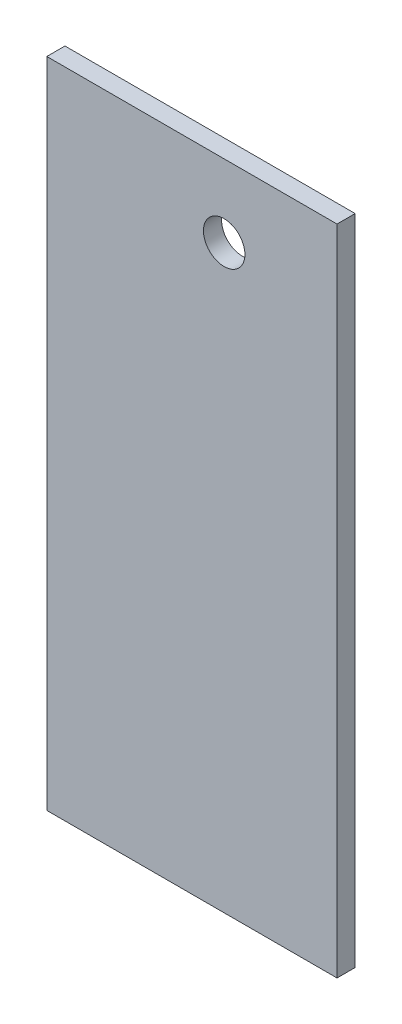
ISO-10303-21;
HEADER;
FILE_DESCRIPTION(('STEP AP214'),'2;1');
FILE_NAME('part.step','',(''),(''),'','','');
FILE_SCHEMA(('AUTOMOTIVE_DESIGN { 1 0 10303 214 1 1 1 1 }'));
ENDSEC;
DATA;
#1=APPLICATION_CONTEXT('core data for automotive mechanical design processes');
#2=APPLICATION_PROTOCOL_DEFINITION('international standard','automotive_design',2000,#1);
#3=PRODUCT_CONTEXT('',#1,'mechanical');
#4=PRODUCT('Part','Part','',(#3));
#5=PRODUCT_RELATED_PRODUCT_CATEGORY('part','',(#4));
#6=PRODUCT_DEFINITION_FORMATION('','',#4);
#7=PRODUCT_DEFINITION_CONTEXT('part definition',#1,'design');
#8=PRODUCT_DEFINITION('design','',#6,#7);
#9=PRODUCT_DEFINITION_SHAPE('','',#8);
#10=(LENGTH_UNIT() NAMED_UNIT(*) SI_UNIT(.MILLI.,.METRE.));
#11=(NAMED_UNIT(*) PLANE_ANGLE_UNIT() SI_UNIT($,.RADIAN.));
#12=(NAMED_UNIT(*) SI_UNIT($,.STERADIAN.) SOLID_ANGLE_UNIT());
#13=UNCERTAINTY_MEASURE_WITH_UNIT(LENGTH_MEASURE(1.E-05),#10,'distance_accuracy_value','');
#14=(GEOMETRIC_REPRESENTATION_CONTEXT(3) GLOBAL_UNCERTAINTY_ASSIGNED_CONTEXT((#13)) GLOBAL_UNIT_ASSIGNED_CONTEXT((#10,
#11,#12)) REPRESENTATION_CONTEXT('',''));
#15=CARTESIAN_POINT('',(0.,0.,0.));
#16=DIRECTION('',(0.,0.,1.));
#17=DIRECTION('',(1.,0.,0.));
#18=AXIS2_PLACEMENT_3D('',#15,#16,#17);
#19=CARTESIAN_POINT('',(0.,0.,5.));
#20=DIRECTION('',(0.,0.,-1.));
#21=DIRECTION('',(-1.,0.,0.));
#22=AXIS2_PLACEMENT_3D('',#19,#20,#21);
#23=PLANE('',#22);
#24=DIRECTION('',(0.,-1.,0.));
#25=VECTOR('',#24,1.);
#26=CARTESIAN_POINT('',(-28.8857592055276,76.0000000000012,5.));
#27=LINE('',#26,#25);
#28=CARTESIAN_POINT('',(-28.8857592055276,256.000000000001,5.));
#29=VERTEX_POINT('',#28);
#30=CARTESIAN_POINT('',(-28.8857592055276,76.0000000000012,5.));
#31=VERTEX_POINT('',#30);
#32=EDGE_CURVE('E87',#29,#31,#27,.T.);
#33=ORIENTED_EDGE('',*,*,#32,.T.);
#34=DIRECTION('',(1.,0.,0.));
#35=VECTOR('',#34,1.);
#36=CARTESIAN_POINT('',(-28.8857592055276,76.0000000000012,5.));
#37=LINE('',#36,#35);
#38=CARTESIAN_POINT('',(51.1142407944725,76.0000000000012,5.));
#39=VERTEX_POINT('',#38);
#40=EDGE_CURVE('E82',#31,#39,#37,.T.);
#41=ORIENTED_EDGE('',*,*,#40,.T.);
#42=DIRECTION('',(0.,1.,0.));
#43=VECTOR('',#42,1.);
#44=CARTESIAN_POINT('',(51.1142407944725,76.0000000000012,5.));
#45=LINE('',#44,#43);
#46=CARTESIAN_POINT('',(51.1142407944725,256.000000000001,5.));
#47=VERTEX_POINT('',#46);
#48=EDGE_CURVE('E85',#39,#47,#45,.T.);
#49=ORIENTED_EDGE('',*,*,#48,.T.);
#50=DIRECTION('',(-1.,0.,0.));
#51=VECTOR('',#50,1.);
#52=CARTESIAN_POINT('',(-28.8857592055276,256.000000000001,5.));
#53=LINE('',#52,#51);
#54=EDGE_CURVE('E52',#47,#29,#53,.T.);
#55=ORIENTED_EDGE('',*,*,#54,.T.);
#56=EDGE_LOOP('',(#33,#41,#49,#55));
#57=FACE_BOUND('',#56,.T.);
#58=CARTESIAN_POINT('',(20.,236.000000000001,5.));
#59=DIRECTION('',(0.,0.,1.));
#60=DIRECTION('',(1.,0.,0.));
#61=AXIS2_PLACEMENT_3D('',#58,#59,#60);
#62=CIRCLE('',#61,5.71589137975318);
#63=CARTESIAN_POINT('',(25.7158913797532,236.000000000001,5.));
#64=VERTEX_POINT('',#63);
#65=EDGE_CURVE('E102',#64,#64,#62,.T.);
#66=ORIENTED_EDGE('',*,*,#65,.F.);
#67=EDGE_LOOP('',(#66));
#68=FACE_BOUND('',#67,.T.);
#69=ADVANCED_FACE('F35',(#57,#68),#23,.F.);
#70=CARTESIAN_POINT('',(0.,0.,0.));
#71=DIRECTION('',(0.,0.,-1.));
#72=DIRECTION('',(-1.,0.,0.));
#73=AXIS2_PLACEMENT_3D('',#70,#71,#72);
#74=PLANE('',#73);
#75=DIRECTION('',(0.,-1.,0.));
#76=VECTOR('',#75,1.);
#77=CARTESIAN_POINT('',(-28.8857592055276,76.0000000000012,0.));
#78=LINE('',#77,#76);
#79=CARTESIAN_POINT('',(-28.8857592055276,256.000000000001,0.));
#80=VERTEX_POINT('',#79);
#81=CARTESIAN_POINT('',(-28.8857592055276,76.0000000000012,0.));
#82=VERTEX_POINT('',#81);
#83=EDGE_CURVE('E99',#80,#82,#78,.T.);
#84=ORIENTED_EDGE('',*,*,#83,.F.);
#85=DIRECTION('',(-1.,0.,0.));
#86=VECTOR('',#85,1.);
#87=CARTESIAN_POINT('',(-28.8857592055276,256.000000000001,0.));
#88=LINE('',#87,#86);
#89=CARTESIAN_POINT('',(51.1142407944725,256.000000000001,0.));
#90=VERTEX_POINT('',#89);
#91=EDGE_CURVE('E75',#90,#80,#88,.T.);
#92=ORIENTED_EDGE('',*,*,#91,.F.);
#93=DIRECTION('',(0.,1.,0.));
#94=VECTOR('',#93,1.);
#95=CARTESIAN_POINT('',(51.1142407944725,76.0000000000012,0.));
#96=LINE('',#95,#94);
#97=CARTESIAN_POINT('',(51.1142407944725,76.0000000000012,0.));
#98=VERTEX_POINT('',#97);
#99=EDGE_CURVE('E69',#98,#90,#96,.T.);
#100=ORIENTED_EDGE('',*,*,#99,.F.);
#101=DIRECTION('',(1.,0.,0.));
#102=VECTOR('',#101,1.);
#103=CARTESIAN_POINT('',(-28.8857592055276,76.0000000000012,0.));
#104=LINE('',#103,#102);
#105=EDGE_CURVE('E91',#82,#98,#104,.T.);
#106=ORIENTED_EDGE('',*,*,#105,.F.);
#107=EDGE_LOOP('',(#84,#92,#100,#106));
#108=FACE_BOUND('',#107,.T.);
#109=CARTESIAN_POINT('',(20.,236.000000000001,0.));
#110=DIRECTION('',(0.,0.,1.));
#111=DIRECTION('',(1.,0.,0.));
#112=AXIS2_PLACEMENT_3D('',#109,#110,#111);
#113=CIRCLE('',#112,5.71589137975318);
#114=CARTESIAN_POINT('',(25.7158913797532,236.000000000001,0.));
#115=VERTEX_POINT('',#114);
#116=EDGE_CURVE('E114',#115,#115,#113,.T.);
#117=ORIENTED_EDGE('',*,*,#116,.T.);
#118=EDGE_LOOP('',(#117));
#119=FACE_BOUND('',#118,.T.);
#120=ADVANCED_FACE('F110',(#108,#119),#74,.T.);
#121=CARTESIAN_POINT('',(-28.8857592055276,76.0000000000012,5.));
#122=DIRECTION('',(1.,0.,0.));
#123=DIRECTION('',(0.,0.,-1.));
#124=AXIS2_PLACEMENT_3D('',#121,#122,#123);
#125=PLANE('',#124);
#126=ORIENTED_EDGE('',*,*,#83,.T.);
#127=DIRECTION('',(0.,0.,-1.));
#128=VECTOR('',#127,1.);
#129=CARTESIAN_POINT('',(-28.8857592055276,76.0000000000012,5.));
#130=LINE('',#129,#128);
#131=EDGE_CURVE('E11',#31,#82,#130,.T.);
#132=ORIENTED_EDGE('',*,*,#131,.F.);
#133=ORIENTED_EDGE('',*,*,#32,.F.);
#134=DIRECTION('',(0.,0.,-1.));
#135=VECTOR('',#134,1.);
#136=CARTESIAN_POINT('',(-28.8857592055276,256.000000000001,5.));
#137=LINE('',#136,#135);
#138=EDGE_CURVE('E95',#29,#80,#137,.T.);
#139=ORIENTED_EDGE('',*,*,#138,.T.);
#140=EDGE_LOOP('',(#126,#132,#133,#139));
#141=FACE_BOUND('',#140,.T.);
#142=ADVANCED_FACE('F37',(#141),#125,.F.);
#143=CARTESIAN_POINT('',(-28.8857592055276,76.0000000000012,5.));
#144=DIRECTION('',(0.,1.,0.));
#145=DIRECTION('',(0.,0.,1.));
#146=AXIS2_PLACEMENT_3D('',#143,#144,#145);
#147=PLANE('',#146);
#148=ORIENTED_EDGE('',*,*,#105,.T.);
#149=DIRECTION('',(0.,0.,-1.));
#150=VECTOR('',#149,1.);
#151=CARTESIAN_POINT('',(51.1142407944725,76.0000000000012,5.));
#152=LINE('',#151,#150);
#153=EDGE_CURVE('E44',#39,#98,#152,.T.);
#154=ORIENTED_EDGE('',*,*,#153,.F.);
#155=ORIENTED_EDGE('',*,*,#40,.F.);
#156=ORIENTED_EDGE('',*,*,#131,.T.);
#157=EDGE_LOOP('',(#148,#154,#155,#156));
#158=FACE_BOUND('',#157,.T.);
#159=ADVANCED_FACE('F90',(#158),#147,.F.);
#160=CARTESIAN_POINT('',(51.1142407944725,76.0000000000012,5.));
#161=DIRECTION('',(-1.,0.,0.));
#162=DIRECTION('',(0.,0.,1.));
#163=AXIS2_PLACEMENT_3D('',#160,#161,#162);
#164=PLANE('',#163);
#165=ORIENTED_EDGE('',*,*,#99,.T.);
#166=DIRECTION('',(0.,0.,-1.));
#167=VECTOR('',#166,1.);
#168=CARTESIAN_POINT('',(51.1142407944725,256.000000000001,5.));
#169=LINE('',#168,#167);
#170=EDGE_CURVE('E92',#47,#90,#169,.T.);
#171=ORIENTED_EDGE('',*,*,#170,.F.);
#172=ORIENTED_EDGE('',*,*,#48,.F.);
#173=ORIENTED_EDGE('',*,*,#153,.T.);
#174=EDGE_LOOP('',(#165,#171,#172,#173));
#175=FACE_BOUND('',#174,.T.);
#176=ADVANCED_FACE('F93',(#175),#164,.F.);
#177=CARTESIAN_POINT('',(-28.8857592055276,256.000000000001,5.));
#178=DIRECTION('',(0.,-1.,0.));
#179=DIRECTION('',(0.,0.,-1.));
#180=AXIS2_PLACEMENT_3D('',#177,#178,#179);
#181=PLANE('',#180);
#182=ORIENTED_EDGE('',*,*,#91,.T.);
#183=ORIENTED_EDGE('',*,*,#138,.F.);
#184=ORIENTED_EDGE('',*,*,#54,.F.);
#185=ORIENTED_EDGE('',*,*,#170,.T.);
#186=EDGE_LOOP('',(#182,#183,#184,#185));
#187=FACE_BOUND('',#186,.T.);
#188=ADVANCED_FACE('F107',(#187),#181,.F.);
#189=CARTESIAN_POINT('',(20.,236.000000000001,5.));
#190=DIRECTION('',(0.,0.,-1.));
#191=DIRECTION('',(-1.,0.,0.));
#192=AXIS2_PLACEMENT_3D('',#189,#190,#191);
#193=CYLINDRICAL_SURFACE('',#192,5.71589137975318);
#194=ORIENTED_EDGE('',*,*,#65,.T.);
#195=EDGE_LOOP('',(#194));
#196=FACE_BOUND('',#195,.T.);
#197=ORIENTED_EDGE('',*,*,#116,.F.);
#198=EDGE_LOOP('',(#197));
#199=FACE_BOUND('',#198,.T.);
#200=ADVANCED_FACE('F120',(#196,#199),#193,.F.);
#201=CLOSED_SHELL('',(#69,#120,#142,#159,#176,#188,#200));
#202=MANIFOLD_SOLID_BREP('B2',#201);
#203=ADVANCED_BREP_SHAPE_REPRESENTATION('',(#18,#202),#14);
#204=SHAPE_DEFINITION_REPRESENTATION(#9,#203);
ENDSEC;
END-ISO-10303-21;
